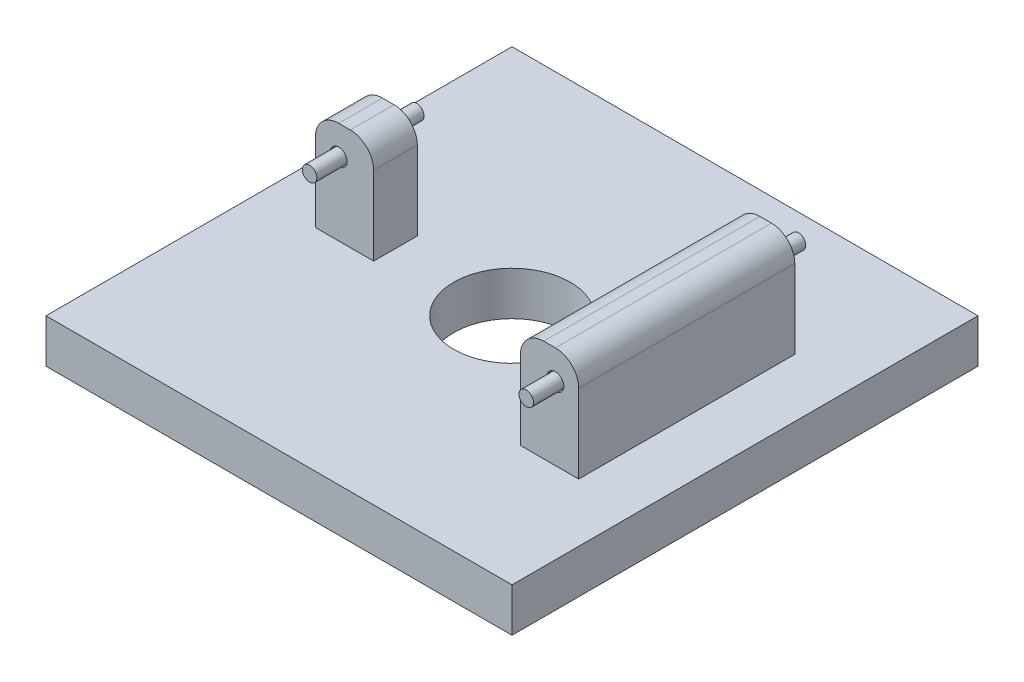
ISO-10303-21;
HEADER;
FILE_DESCRIPTION(('STEP AP214'),'2;1');
FILE_NAME('part.step','',(''),(''),'','','');
FILE_SCHEMA(('AUTOMOTIVE_DESIGN { 1 0 10303 214 1 1 1 1 }'));
ENDSEC;
DATA;
#1=APPLICATION_CONTEXT('core data for automotive mechanical design processes');
#2=APPLICATION_PROTOCOL_DEFINITION('international standard','automotive_design',2000,#1);
#3=PRODUCT_CONTEXT('',#1,'mechanical');
#4=PRODUCT('Part','Part','',(#3));
#5=PRODUCT_RELATED_PRODUCT_CATEGORY('part','',(#4));
#6=PRODUCT_DEFINITION_FORMATION('','',#4);
#7=PRODUCT_DEFINITION_CONTEXT('part definition',#1,'design');
#8=PRODUCT_DEFINITION('design','',#6,#7);
#9=PRODUCT_DEFINITION_SHAPE('','',#8);
#10=(LENGTH_UNIT() NAMED_UNIT(*) SI_UNIT(.MILLI.,.METRE.));
#11=(NAMED_UNIT(*) PLANE_ANGLE_UNIT() SI_UNIT($,.RADIAN.));
#12=(NAMED_UNIT(*) SI_UNIT($,.STERADIAN.) SOLID_ANGLE_UNIT());
#13=UNCERTAINTY_MEASURE_WITH_UNIT(LENGTH_MEASURE(1.E-05),#10,'distance_accuracy_value','');
#14=(GEOMETRIC_REPRESENTATION_CONTEXT(3) GLOBAL_UNCERTAINTY_ASSIGNED_CONTEXT((#13)) GLOBAL_UNIT_ASSIGNED_CONTEXT((#10,
#11,#12)) REPRESENTATION_CONTEXT('',''));
#15=CARTESIAN_POINT('',(0.,0.,0.));
#16=DIRECTION('',(0.,0.,1.));
#17=DIRECTION('',(1.,0.,0.));
#18=AXIS2_PLACEMENT_3D('',#15,#16,#17);
#19=CARTESIAN_POINT('',(16.51,12.7,-14.7209108940373));
#20=DIRECTION('',(0.,0.,1.));
#21=DIRECTION('',(1.,0.,0.));
#22=AXIS2_PLACEMENT_3D('',#19,#20,#21);
#23=CYLINDRICAL_SURFACE('',#22,0.793749999999999);
#24=CARTESIAN_POINT('',(16.51,12.7,-14.7209108940373));
#25=DIRECTION('',(0.,0.,1.));
#26=DIRECTION('',(1.,0.,0.));
#27=AXIS2_PLACEMENT_3D('',#24,#25,#26);
#28=CIRCLE('',#27,0.793749999999999);
#29=CARTESIAN_POINT('',(17.30375,12.7,-14.7209108940373));
#30=VERTEX_POINT('',#29);
#31=EDGE_CURVE('E12',#30,#30,#28,.T.);
#32=CARTESIAN_POINT('',(16.51,12.7,14.95425));
#33=DIRECTION('',(0.,0.,1.));
#34=DIRECTION('',(1.,0.,0.));
#35=AXIS2_PLACEMENT_3D('',#32,#33,#34);
#36=CIRCLE('',#35,0.793749999999999);
#37=CARTESIAN_POINT('',(17.30375,12.7,14.95425));
#38=VERTEX_POINT('',#37);
#39=EDGE_CURVE('E47',#38,#38,#36,.T.);
#40=CARTESIAN_POINT('',(17.30375,12.7,-14.7209108940373));
#41=CARTESIAN_POINT('',(17.30375,12.7,-14.4117946347244));
#42=CARTESIAN_POINT('',(17.30375,12.7,-14.1026783754115));
#43=CARTESIAN_POINT('',(17.30375,12.7,-13.4844458567858));
#44=CARTESIAN_POINT('',(17.30375,12.7,-13.1753295974729));
#45=CARTESIAN_POINT('',(17.30375,12.7,-12.5570970788471));
#46=CARTESIAN_POINT('',(17.30375,12.7,-12.2479808195342));
#47=CARTESIAN_POINT('',(17.30375,12.7,-11.6297483009084));
#48=CARTESIAN_POINT('',(17.30375,12.7,-11.3206320415955));
#49=CARTESIAN_POINT('',(17.30375,12.7,-10.7023995229698));
#50=CARTESIAN_POINT('',(17.30375,12.7,-10.3932832636569));
#51=CARTESIAN_POINT('',(17.30375,12.7,-9.77505074503109));
#52=CARTESIAN_POINT('',(17.30375,12.7,-9.46593448571821));
#53=CARTESIAN_POINT('',(17.30375,12.7,-8.84770196709243));
#54=CARTESIAN_POINT('',(17.30375,12.7,-8.53858570777954));
#55=CARTESIAN_POINT('',(17.30375,12.7,-7.92035318915376));
#56=CARTESIAN_POINT('',(17.30375,12.7,-7.61123692984087));
#57=CARTESIAN_POINT('',(17.30375,12.7,-6.9930044112151));
#58=CARTESIAN_POINT('',(17.30375,12.7,-6.68388815190221));
#59=CARTESIAN_POINT('',(17.30375,12.7,-6.06565563327643));
#60=CARTESIAN_POINT('',(17.30375,12.7,-5.75653937396354));
#61=CARTESIAN_POINT('',(17.30375,12.7,-5.13830685533776));
#62=CARTESIAN_POINT('',(17.30375,12.7,-4.82919059602488));
#63=CARTESIAN_POINT('',(17.30375,12.7,-4.2109580773991));
#64=CARTESIAN_POINT('',(17.30375,12.7,-3.90184181808621));
#65=CARTESIAN_POINT('',(17.30375,12.7,-3.28360929946043));
#66=CARTESIAN_POINT('',(17.30375,12.7,-2.97449304014755));
#67=CARTESIAN_POINT('',(17.30375,12.7,-2.35626052152177));
#68=CARTESIAN_POINT('',(17.30375,12.7,-2.04714426220888));
#69=CARTESIAN_POINT('',(17.30375,12.7,-1.4289117435831));
#70=CARTESIAN_POINT('',(17.30375,12.7,-1.11979548427021));
#71=CARTESIAN_POINT('',(17.30375,12.7,-0.501562965644435));
#72=CARTESIAN_POINT('',(17.30375,12.7,-0.192446706331546));
#73=CARTESIAN_POINT('',(17.30375,12.7,0.425785812294232));
#74=CARTESIAN_POINT('',(17.30375,12.7,0.73490207160712));
#75=CARTESIAN_POINT('',(17.30375,12.7,1.3531345902329));
#76=CARTESIAN_POINT('',(17.30375,12.7,1.66225084954579));
#77=CARTESIAN_POINT('',(17.30375,12.7,2.28048336817156));
#78=CARTESIAN_POINT('',(17.30375,12.7,2.58959962748445));
#79=CARTESIAN_POINT('',(17.30375,12.7,3.20783214611023));
#80=CARTESIAN_POINT('',(17.30375,12.7,3.51694840542312));
#81=CARTESIAN_POINT('',(17.30375,12.7,4.1351809240489));
#82=CARTESIAN_POINT('',(17.30375,12.7,4.44429718336179));
#83=CARTESIAN_POINT('',(17.30375,12.7,5.06252970198756));
#84=CARTESIAN_POINT('',(17.30375,12.7,5.37164596130045));
#85=CARTESIAN_POINT('',(17.30375,12.7,5.98987847992623));
#86=CARTESIAN_POINT('',(17.30375,12.7,6.29899473923912));
#87=CARTESIAN_POINT('',(17.30375,12.7,6.9172272578649));
#88=CARTESIAN_POINT('',(17.30375,12.7,7.22634351717778));
#89=CARTESIAN_POINT('',(17.30375,12.7,7.84457603580356));
#90=CARTESIAN_POINT('',(17.30375,12.7,8.15369229511645));
#91=CARTESIAN_POINT('',(17.30375,12.7,8.77192481374223));
#92=CARTESIAN_POINT('',(17.30375,12.7,9.08104107305511));
#93=CARTESIAN_POINT('',(17.30375,12.7,9.69927359168089));
#94=CARTESIAN_POINT('',(17.30375,12.7,10.0083898509938));
#95=CARTESIAN_POINT('',(17.30375,12.7,10.6266223696196));
#96=CARTESIAN_POINT('',(17.30375,12.7,10.9357386289324));
#97=CARTESIAN_POINT('',(17.30375,12.7,11.5539711475582));
#98=CARTESIAN_POINT('',(17.30375,12.7,11.8630874068711));
#99=CARTESIAN_POINT('',(17.30375,12.7,12.4813199254969));
#100=CARTESIAN_POINT('',(17.30375,12.7,12.7904361848098));
#101=CARTESIAN_POINT('',(17.30375,12.7,13.4086687034356));
#102=CARTESIAN_POINT('',(17.30375,12.7,13.7177849627484));
#103=CARTESIAN_POINT('',(17.30375,12.7,14.3360174813742));
#104=CARTESIAN_POINT('',(17.30375,12.7,14.6451337406871));
#105=CARTESIAN_POINT('',(17.30375,12.7,14.95425));
#106=B_SPLINE_CURVE_WITH_KNOTS('',3,(#40,#41,#42,#43,#44,#45,#46,#47,#48,#49,#50,#51,#52,#53,
#54,#55,#56,#57,#58,#59,#60,#61,#62,#63,#64,#65,#66,#67,#68,#69,#70,#71,#72,#73,#74,#75,#76,#77,
#78,#79,#80,#81,#82,#83,#84,#85,#86,#87,#88,#89,#90,#91,#92,#93,#94,#95,#96,#97,#98,#99,#100,
#101,#102,#103,#104,#105),.UNSPECIFIED.,.F.,.F.,(4,2,2,2,2,2,2,2,2,2,2,2,2,2,2,2,2,2,2,2,2,2,2,
2,2,2,2,2,2,2,2,2,4),(0.,0.927348777938666,1.85469755587733,2.782046333816,3.70939511175467,
4.63674388969333,5.564092667632,6.49144144557066,7.41879022350933,8.34613900144799,
9.27348777938666,10.2008365573253,11.128185335264,12.0555341132027,12.9828828911413,
13.91023166908,14.8375804470187,15.7649292249573,16.692278002896,17.6196267808347,
18.5469755587733,19.474324336712,20.4016731146507,21.3290218925893,22.256370670528,
23.1837194484666,24.1110682264053,25.038417004344,25.9657657822826,26.8931145602213,
27.82046333816,28.7478121160986,29.6751608940373),.UNSPECIFIED.);
#107=EDGE_CURVE('BSEAM41',#30,#38,#106,.T.);
#108=ORIENTED_EDGE('',*,*,#31,.T.);
#109=ORIENTED_EDGE('',*,*,#39,.F.);
#110=ORIENTED_EDGE('',*,*,#107,.T.);
#111=ORIENTED_EDGE('',*,*,#107,.F.);
#112=EDGE_LOOP('',(#108,#110,#109,#111));
#113=FACE_BOUND('',#112,.T.);
#114=ADVANCED_FACE('F41',(#113),#23,.T.);
#115=CARTESIAN_POINT('',(16.51,12.7,-14.7209108940373));
#116=DIRECTION('',(0.,0.,1.));
#117=DIRECTION('',(1.,0.,0.));
#118=AXIS2_PLACEMENT_3D('',#115,#116,#117);
#119=PLANE('',#118);
#120=ORIENTED_EDGE('',*,*,#31,.F.);
#121=EDGE_LOOP('',(#120));
#122=FACE_BOUND('',#121,.T.);
#123=ADVANCED_FACE('F56',(#122),#119,.F.);
#124=CARTESIAN_POINT('',(16.51,12.7,14.95425));
#125=DIRECTION('',(0.,0.,1.));
#126=DIRECTION('',(1.,0.,0.));
#127=AXIS2_PLACEMENT_3D('',#124,#125,#126);
#128=PLANE('',#127);
#129=ORIENTED_EDGE('',*,*,#39,.T.);
#130=EDGE_LOOP('',(#129));
#131=FACE_BOUND('',#130,.T.);
#132=ADVANCED_FACE('F53',(#131),#128,.T.);
#133=CLOSED_SHELL('',(#114,#123,#132));
#134=MANIFOLD_SOLID_BREP('B2',#133);
#135=CARTESIAN_POINT('',(-16.51,12.7,-6.12774999999997));
#136=DIRECTION('',(0.,0.,1.));
#137=DIRECTION('',(1.,0.,0.));
#138=AXIS2_PLACEMENT_3D('',#135,#136,#137);
#139=CYLINDRICAL_SURFACE('',#138,0.793749999999999);
#140=CARTESIAN_POINT('',(-16.51,12.7,-6.12774999999997));
#141=DIRECTION('',(0.,0.,1.));
#142=DIRECTION('',(1.,0.,0.));
#143=AXIS2_PLACEMENT_3D('',#140,#141,#142);
#144=CIRCLE('',#143,0.793749999999999);
#145=CARTESIAN_POINT('',(-15.71625,12.7,-6.12774999999997));
#146=VERTEX_POINT('',#145);
#147=EDGE_CURVE('E40',#146,#146,#144,.T.);
#148=ORIENTED_EDGE('',*,*,#147,.T.);
#149=EDGE_LOOP('',(#148));
#150=FACE_BOUND('',#149,.T.);
#151=CARTESIAN_POINT('',(-16.51,12.7,5.55624999999999));
#152=DIRECTION('',(0.,0.,1.));
#153=DIRECTION('',(1.,0.,0.));
#154=AXIS2_PLACEMENT_3D('',#151,#152,#153);
#155=CIRCLE('',#154,0.793749999999999);
#156=CARTESIAN_POINT('',(-15.71625,12.7,5.55624999999999));
#157=VERTEX_POINT('',#156);
#158=EDGE_CURVE('E96',#157,#157,#155,.T.);
#159=ORIENTED_EDGE('',*,*,#158,.F.);
#160=EDGE_LOOP('',(#159));
#161=FACE_BOUND('',#160,.T.);
#162=ADVANCED_FACE('F90',(#150,#161),#139,.T.);
#163=CARTESIAN_POINT('',(-16.51,12.7,-6.12774999999997));
#164=DIRECTION('',(0.,0.,1.));
#165=DIRECTION('',(1.,0.,0.));
#166=AXIS2_PLACEMENT_3D('',#163,#164,#165);
#167=PLANE('',#166);
#168=ORIENTED_EDGE('',*,*,#147,.F.);
#169=EDGE_LOOP('',(#168));
#170=FACE_BOUND('',#169,.T.);
#171=ADVANCED_FACE('F105',(#170),#167,.F.);
#172=CARTESIAN_POINT('',(-16.51,12.7,5.55624999999999));
#173=DIRECTION('',(0.,0.,1.));
#174=DIRECTION('',(1.,0.,0.));
#175=AXIS2_PLACEMENT_3D('',#172,#173,#174);
#176=PLANE('',#175);
#177=ORIENTED_EDGE('',*,*,#158,.T.);
#178=EDGE_LOOP('',(#177));
#179=FACE_BOUND('',#178,.T.);
#180=ADVANCED_FACE('F102',(#179),#176,.T.);
#181=CLOSED_SHELL('',(#162,#171,#180));
#182=MANIFOLD_SOLID_BREP('B7',#181);
#183=CARTESIAN_POINT('',(0.,4.7625,0.));
#184=DIRECTION('',(0.,1.,0.));
#185=DIRECTION('',(0.,0.,1.));
#186=AXIS2_PLACEMENT_3D('',#183,#184,#185);
#187=PLANE('',#186);
#188=CARTESIAN_POINT('',(0.,4.7625,0.));
#189=DIRECTION('',(0.,1.,0.));
#190=DIRECTION('',(0.,0.,1.));
#191=AXIS2_PLACEMENT_3D('',#188,#189,#190);
#192=CIRCLE('',#191,6.35);
#193=CARTESIAN_POINT('',(0.,4.7625,6.35));
#194=VERTEX_POINT('',#193);
#195=EDGE_CURVE('E307',#194,#194,#192,.T.);
#196=ORIENTED_EDGE('',*,*,#195,.F.);
#197=EDGE_LOOP('',(#196));
#198=FACE_BOUND('',#197,.T.);
#199=DIRECTION('',(0.,0.,-1.));
#200=VECTOR('',#199,1.);
#201=CARTESIAN_POINT('',(25.4,4.7625,-25.4));
#202=LINE('',#201,#200);
#203=CARTESIAN_POINT('',(25.4,4.7625,25.4));
#204=VERTEX_POINT('',#203);
#205=CARTESIAN_POINT('',(25.4,4.7625,-25.4));
#206=VERTEX_POINT('',#205);
#207=EDGE_CURVE('E314',#204,#206,#202,.T.);
#208=ORIENTED_EDGE('',*,*,#207,.T.);
#209=DIRECTION('',(-1.,0.,0.));
#210=VECTOR('',#209,1.);
#211=CARTESIAN_POINT('',(-25.4,4.7625,-25.4));
#212=LINE('',#211,#210);
#213=CARTESIAN_POINT('',(-25.4,4.7625,-25.4));
#214=VERTEX_POINT('',#213);
#215=EDGE_CURVE('E317',#206,#214,#212,.T.);
#216=ORIENTED_EDGE('',*,*,#215,.T.);
#217=DIRECTION('',(0.,0.,1.));
#218=VECTOR('',#217,1.);
#219=CARTESIAN_POINT('',(-25.4,4.7625,-25.4));
#220=LINE('',#219,#218);
#221=CARTESIAN_POINT('',(-25.4,4.7625,25.4));
#222=VERTEX_POINT('',#221);
#223=EDGE_CURVE('E320',#214,#222,#220,.T.);
#224=ORIENTED_EDGE('',*,*,#223,.T.);
#225=DIRECTION('',(1.,0.,0.));
#226=VECTOR('',#225,1.);
#227=CARTESIAN_POINT('',(-25.4,4.7625,25.4));
#228=LINE('',#227,#226);
#229=EDGE_CURVE('E322',#222,#204,#228,.T.);
#230=ORIENTED_EDGE('',*,*,#229,.T.);
#231=EDGE_LOOP('',(#208,#216,#224,#230));
#232=FACE_BOUND('',#231,.T.);
#233=DIRECTION('',(1.,0.,0.));
#234=VECTOR('',#233,1.);
#235=CARTESIAN_POINT('',(-19.05,4.7625,2.38124999999999));
#236=LINE('',#235,#234);
#237=CARTESIAN_POINT('',(-19.05,4.7625,2.38124999999999));
#238=VERTEX_POINT('',#237);
#239=CARTESIAN_POINT('',(-12.7,4.7625,2.38124999999999));
#240=VERTEX_POINT('',#239);
#241=EDGE_CURVE('E292',#238,#240,#236,.T.);
#242=ORIENTED_EDGE('',*,*,#241,.F.);
#243=DIRECTION('',(0.,0.,1.));
#244=VECTOR('',#243,1.);
#245=CARTESIAN_POINT('',(-19.05,4.7625,-2.38125000000001));
#246=LINE('',#245,#244);
#247=CARTESIAN_POINT('',(-19.05,4.7625,-2.38125000000001));
#248=VERTEX_POINT('',#247);
#249=EDGE_CURVE('E255',#248,#238,#246,.T.);
#250=ORIENTED_EDGE('',*,*,#249,.F.);
#251=DIRECTION('',(-1.,0.,0.));
#252=VECTOR('',#251,1.);
#253=CARTESIAN_POINT('',(-19.05,4.7625,-2.38125000000001));
#254=LINE('',#253,#252);
#255=CARTESIAN_POINT('',(-12.7,4.7625,-2.38125));
#256=VERTEX_POINT('',#255);
#257=EDGE_CURVE('E286',#256,#248,#254,.T.);
#258=ORIENTED_EDGE('',*,*,#257,.F.);
#259=DIRECTION('',(0.,0.,-1.));
#260=VECTOR('',#259,1.);
#261=CARTESIAN_POINT('',(-12.7,4.7625,-2.38125));
#262=LINE('',#261,#260);
#263=EDGE_CURVE('E295',#240,#256,#262,.T.);
#264=ORIENTED_EDGE('',*,*,#263,.F.);
#265=EDGE_LOOP('',(#242,#250,#258,#264));
#266=FACE_BOUND('',#265,.T.);
#267=DIRECTION('',(-1.,0.,0.));
#268=VECTOR('',#267,1.);
#269=CARTESIAN_POINT('',(19.05,4.7625,-11.77925));
#270=LINE('',#269,#268);
#271=CARTESIAN_POINT('',(19.05,4.7625,-11.77925));
#272=VERTEX_POINT('',#271);
#273=CARTESIAN_POINT('',(12.7,4.7625,-11.77925));
#274=VERTEX_POINT('',#273);
#275=EDGE_CURVE('E250',#272,#274,#270,.T.);
#276=ORIENTED_EDGE('',*,*,#275,.F.);
#277=DIRECTION('',(0.,0.,-1.));
#278=VECTOR('',#277,1.);
#279=CARTESIAN_POINT('',(19.05,4.7625,-11.77925));
#280=LINE('',#279,#278);
#281=CARTESIAN_POINT('',(19.05,4.7625,11.77925));
#282=VERTEX_POINT('',#281);
#283=EDGE_CURVE('E259',#282,#272,#280,.T.);
#284=ORIENTED_EDGE('',*,*,#283,.F.);
#285=DIRECTION('',(1.,0.,0.));
#286=VECTOR('',#285,1.);
#287=CARTESIAN_POINT('',(19.05,4.7625,11.77925));
#288=LINE('',#287,#286);
#289=CARTESIAN_POINT('',(12.7,4.7625,11.77925));
#290=VERTEX_POINT('',#289);
#291=EDGE_CURVE('E271',#290,#282,#288,.T.);
#292=ORIENTED_EDGE('',*,*,#291,.F.);
#293=DIRECTION('',(0.,0.,1.));
#294=VECTOR('',#293,1.);
#295=CARTESIAN_POINT('',(12.7,4.7625,-11.77925));
#296=LINE('',#295,#294);
#297=EDGE_CURVE('E269',#274,#290,#296,.T.);
#298=ORIENTED_EDGE('',*,*,#297,.F.);
#299=EDGE_LOOP('',(#276,#284,#292,#298));
#300=FACE_BOUND('',#299,.T.);
#301=ADVANCED_FACE('F131',(#198,#232,#266,#300),#187,.T.);
#302=CARTESIAN_POINT('',(25.4,4.7625,-25.4));
#303=DIRECTION('',(-1.,0.,0.));
#304=DIRECTION('',(0.,0.,1.));
#305=AXIS2_PLACEMENT_3D('',#302,#303,#304);
#306=PLANE('',#305);
#307=DIRECTION('',(0.,0.,-1.));
#308=VECTOR('',#307,1.);
#309=CARTESIAN_POINT('',(25.4,0.,-25.4));
#310=LINE('',#309,#308);
#311=CARTESIAN_POINT('',(25.4,0.,25.4));
#312=VERTEX_POINT('',#311);
#313=CARTESIAN_POINT('',(25.4,0.,-25.4));
#314=VERTEX_POINT('',#313);
#315=EDGE_CURVE('E311',#312,#314,#310,.T.);
#316=ORIENTED_EDGE('',*,*,#315,.T.);
#317=DIRECTION('',(0.,-1.,0.));
#318=VECTOR('',#317,1.);
#319=CARTESIAN_POINT('',(25.4,4.7625,-25.4));
#320=LINE('',#319,#318);
#321=EDGE_CURVE('E340',#206,#314,#320,.T.);
#322=ORIENTED_EDGE('',*,*,#321,.F.);
#323=ORIENTED_EDGE('',*,*,#207,.F.);
#324=DIRECTION('',(0.,-1.,0.));
#325=VECTOR('',#324,1.);
#326=CARTESIAN_POINT('',(25.4,4.7625,25.4));
#327=LINE('',#326,#325);
#328=EDGE_CURVE('E324',#204,#312,#327,.T.);
#329=ORIENTED_EDGE('',*,*,#328,.T.);
#330=EDGE_LOOP('',(#316,#322,#323,#329));
#331=FACE_BOUND('',#330,.T.);
#332=ADVANCED_FACE('F409',(#331),#306,.F.);
#333=CARTESIAN_POINT('',(-25.4,4.7625,-25.4));
#334=DIRECTION('',(0.,0.,1.));
#335=DIRECTION('',(1.,0.,0.));
#336=AXIS2_PLACEMENT_3D('',#333,#334,#335);
#337=PLANE('',#336);
#338=DIRECTION('',(-1.,0.,0.));
#339=VECTOR('',#338,1.);
#340=CARTESIAN_POINT('',(-25.4,0.,-25.4));
#341=LINE('',#340,#339);
#342=CARTESIAN_POINT('',(-25.4,0.,-25.4));
#343=VERTEX_POINT('',#342);
#344=EDGE_CURVE('E327',#314,#343,#341,.T.);
#345=ORIENTED_EDGE('',*,*,#344,.T.);
#346=DIRECTION('',(0.,-1.,0.));
#347=VECTOR('',#346,1.);
#348=CARTESIAN_POINT('',(-25.4,4.7625,-25.4));
#349=LINE('',#348,#347);
#350=EDGE_CURVE('E337',#214,#343,#349,.T.);
#351=ORIENTED_EDGE('',*,*,#350,.F.);
#352=ORIENTED_EDGE('',*,*,#215,.F.);
#353=ORIENTED_EDGE('',*,*,#321,.T.);
#354=EDGE_LOOP('',(#345,#351,#352,#353));
#355=FACE_BOUND('',#354,.T.);
#356=ADVANCED_FACE('F415',(#355),#337,.F.);
#357=CARTESIAN_POINT('',(-25.4,4.7625,-25.4));
#358=DIRECTION('',(1.,0.,0.));
#359=DIRECTION('',(0.,0.,-1.));
#360=AXIS2_PLACEMENT_3D('',#357,#358,#359);
#361=PLANE('',#360);
#362=DIRECTION('',(0.,0.,1.));
#363=VECTOR('',#362,1.);
#364=CARTESIAN_POINT('',(-25.4,0.,-25.4));
#365=LINE('',#364,#363);
#366=CARTESIAN_POINT('',(-25.4,0.,25.4));
#367=VERTEX_POINT('',#366);
#368=EDGE_CURVE('E329',#343,#367,#365,.T.);
#369=ORIENTED_EDGE('',*,*,#368,.T.);
#370=DIRECTION('',(0.,-1.,0.));
#371=VECTOR('',#370,1.);
#372=CARTESIAN_POINT('',(-25.4,4.7625,25.4));
#373=LINE('',#372,#371);
#374=EDGE_CURVE('E334',#222,#367,#373,.T.);
#375=ORIENTED_EDGE('',*,*,#374,.F.);
#376=ORIENTED_EDGE('',*,*,#223,.F.);
#377=ORIENTED_EDGE('',*,*,#350,.T.);
#378=EDGE_LOOP('',(#369,#375,#376,#377));
#379=FACE_BOUND('',#378,.T.);
#380=ADVANCED_FACE('F431',(#379),#361,.F.);
#381=CARTESIAN_POINT('',(-25.4,4.7625,25.4));
#382=DIRECTION('',(0.,0.,-1.));
#383=DIRECTION('',(-1.,0.,0.));
#384=AXIS2_PLACEMENT_3D('',#381,#382,#383);
#385=PLANE('',#384);
#386=DIRECTION('',(1.,0.,0.));
#387=VECTOR('',#386,1.);
#388=CARTESIAN_POINT('',(-25.4,0.,25.4));
#389=LINE('',#388,#387);
#390=EDGE_CURVE('E318',#367,#312,#389,.T.);
#391=ORIENTED_EDGE('',*,*,#390,.T.);
#392=ORIENTED_EDGE('',*,*,#328,.F.);
#393=ORIENTED_EDGE('',*,*,#229,.F.);
#394=ORIENTED_EDGE('',*,*,#374,.T.);
#395=EDGE_LOOP('',(#391,#392,#393,#394));
#396=FACE_BOUND('',#395,.T.);
#397=ADVANCED_FACE('F427',(#396),#385,.F.);
#398=CARTESIAN_POINT('',(0.,0.,0.));
#399=DIRECTION('',(0.,1.,0.));
#400=DIRECTION('',(0.,0.,1.));
#401=AXIS2_PLACEMENT_3D('',#398,#399,#400);
#402=PLANE('',#401);
#403=CARTESIAN_POINT('',(0.,0.,0.));
#404=DIRECTION('',(0.,1.,0.));
#405=DIRECTION('',(0.,0.,1.));
#406=AXIS2_PLACEMENT_3D('',#403,#404,#405);
#407=CIRCLE('',#406,6.35);
#408=CARTESIAN_POINT('',(0.,0.,6.35));
#409=VERTEX_POINT('',#408);
#410=EDGE_CURVE('E308',#409,#409,#407,.T.);
#411=ORIENTED_EDGE('',*,*,#410,.T.);
#412=EDGE_LOOP('',(#411));
#413=FACE_BOUND('',#412,.T.);
#414=ORIENTED_EDGE('',*,*,#315,.F.);
#415=ORIENTED_EDGE('',*,*,#390,.F.);
#416=ORIENTED_EDGE('',*,*,#368,.F.);
#417=ORIENTED_EDGE('',*,*,#344,.F.);
#418=EDGE_LOOP('',(#414,#415,#416,#417));
#419=FACE_BOUND('',#418,.T.);
#420=ADVANCED_FACE('F424',(#413,#419),#402,.F.);
#421=CARTESIAN_POINT('',(0.,0.,0.));
#422=DIRECTION('',(0.,1.,0.));
#423=DIRECTION('',(0.,0.,1.));
#424=AXIS2_PLACEMENT_3D('',#421,#422,#423);
#425=CYLINDRICAL_SURFACE('',#424,6.35);
#426=CARTESIAN_POINT('',(0.,0.,6.35));
#427=CARTESIAN_POINT('',(0.,0.049609375,6.35));
#428=CARTESIAN_POINT('',(0.,0.09921875,6.35));
#429=CARTESIAN_POINT('',(0.,0.1984375,6.35));
#430=CARTESIAN_POINT('',(0.,0.248046875,6.35));
#431=CARTESIAN_POINT('',(0.,0.347265625,6.35));
#432=CARTESIAN_POINT('',(0.,0.396875,6.35));
#433=CARTESIAN_POINT('',(0.,0.49609375,6.35));
#434=CARTESIAN_POINT('',(0.,0.545703125,6.35));
#435=CARTESIAN_POINT('',(0.,0.644921875,6.35));
#436=CARTESIAN_POINT('',(0.,0.69453125,6.35));
#437=CARTESIAN_POINT('',(0.,0.79375,6.35));
#438=CARTESIAN_POINT('',(0.,0.843359375,6.35));
#439=CARTESIAN_POINT('',(0.,0.942578125,6.35));
#440=CARTESIAN_POINT('',(0.,0.9921875,6.35));
#441=CARTESIAN_POINT('',(0.,1.09140625,6.35));
#442=CARTESIAN_POINT('',(0.,1.141015625,6.35));
#443=CARTESIAN_POINT('',(0.,1.240234375,6.35));
#444=CARTESIAN_POINT('',(0.,1.28984375,6.35));
#445=CARTESIAN_POINT('',(0.,1.3890625,6.35));
#446=CARTESIAN_POINT('',(0.,1.438671875,6.35));
#447=CARTESIAN_POINT('',(0.,1.537890625,6.35));
#448=CARTESIAN_POINT('',(0.,1.5875,6.35));
#449=CARTESIAN_POINT('',(0.,1.68671875,6.35));
#450=CARTESIAN_POINT('',(0.,1.736328125,6.35));
#451=CARTESIAN_POINT('',(0.,1.835546875,6.35));
#452=CARTESIAN_POINT('',(0.,1.88515625,6.35));
#453=CARTESIAN_POINT('',(0.,1.984375,6.35));
#454=CARTESIAN_POINT('',(0.,2.033984375,6.35));
#455=CARTESIAN_POINT('',(0.,2.133203125,6.35));
#456=CARTESIAN_POINT('',(0.,2.1828125,6.35));
#457=CARTESIAN_POINT('',(0.,2.28203125,6.35));
#458=CARTESIAN_POINT('',(0.,2.331640625,6.35));
#459=CARTESIAN_POINT('',(0.,2.430859375,6.35));
#460=CARTESIAN_POINT('',(0.,2.48046875,6.35));
#461=CARTESIAN_POINT('',(0.,2.5796875,6.35));
#462=CARTESIAN_POINT('',(0.,2.629296875,6.35));
#463=CARTESIAN_POINT('',(0.,2.728515625,6.35));
#464=CARTESIAN_POINT('',(0.,2.778125,6.35));
#465=CARTESIAN_POINT('',(0.,2.87734375,6.35));
#466=CARTESIAN_POINT('',(0.,2.926953125,6.35));
#467=CARTESIAN_POINT('',(0.,3.026171875,6.35));
#468=CARTESIAN_POINT('',(0.,3.07578125,6.35));
#469=CARTESIAN_POINT('',(0.,3.175,6.35));
#470=CARTESIAN_POINT('',(0.,3.224609375,6.35));
#471=CARTESIAN_POINT('',(0.,3.323828125,6.35));
#472=CARTESIAN_POINT('',(0.,3.3734375,6.35));
#473=CARTESIAN_POINT('',(0.,3.47265625,6.35));
#474=CARTESIAN_POINT('',(0.,3.522265625,6.35));
#475=CARTESIAN_POINT('',(0.,3.621484375,6.35));
#476=CARTESIAN_POINT('',(0.,3.67109375,6.35));
#477=CARTESIAN_POINT('',(0.,3.7703125,6.35));
#478=CARTESIAN_POINT('',(0.,3.819921875,6.35));
#479=CARTESIAN_POINT('',(0.,3.919140625,6.35));
#480=CARTESIAN_POINT('',(0.,3.96875,6.35));
#481=CARTESIAN_POINT('',(0.,4.06796875,6.35));
#482=CARTESIAN_POINT('',(0.,4.117578125,6.35));
#483=CARTESIAN_POINT('',(0.,4.216796875,6.35));
#484=CARTESIAN_POINT('',(0.,4.26640625,6.35));
#485=CARTESIAN_POINT('',(0.,4.365625,6.35));
#486=CARTESIAN_POINT('',(0.,4.415234375,6.35));
#487=CARTESIAN_POINT('',(0.,4.514453125,6.35));
#488=CARTESIAN_POINT('',(0.,4.5640625,6.35));
#489=CARTESIAN_POINT('',(0.,4.66328125,6.35));
#490=CARTESIAN_POINT('',(0.,4.712890625,6.35));
#491=CARTESIAN_POINT('',(0.,4.7625,6.35));
#492=B_SPLINE_CURVE_WITH_KNOTS('',3,(#426,#427,#428,#429,#430,#431,#432,#433,#434,#435,#436,
#437,#438,#439,#440,#441,#442,#443,#444,#445,#446,#447,#448,#449,#450,#451,#452,#453,#454,#455,
#456,#457,#458,#459,#460,#461,#462,#463,#464,#465,#466,#467,#468,#469,#470,#471,#472,#473,#474,
#475,#476,#477,#478,#479,#480,#481,#482,#483,#484,#485,#486,#487,#488,#489,#490,#491),
.UNSPECIFIED.,.F.,.F.,(4,2,2,2,2,2,2,2,2,2,2,2,2,2,2,2,2,2,2,2,2,2,2,2,2,2,2,2,2,2,2,2,4),(0.,
0.148828125,0.29765625,0.446484375,0.5953125,0.744140625,0.89296875,1.041796875,1.190625,
1.339453125,1.48828125,1.637109375,1.7859375,1.934765625,2.08359375,2.232421875,2.38125,
2.530078125,2.67890625,2.827734375,2.9765625,3.125390625,3.27421875,3.423046875,3.571875,
3.720703125,3.86953125,4.018359375,4.1671875,4.316015625,4.46484375,4.613671875,4.7625),.UNSPECIFIED.);
#493=EDGE_CURVE('BSEAM422',#409,#194,#492,.T.);
#494=ORIENTED_EDGE('',*,*,#410,.F.);
#495=ORIENTED_EDGE('',*,*,#195,.T.);
#496=ORIENTED_EDGE('',*,*,#493,.T.);
#497=ORIENTED_EDGE('',*,*,#493,.F.);
#498=EDGE_LOOP('',(#494,#496,#495,#497));
#499=FACE_BOUND('',#498,.T.);
#500=ADVANCED_FACE('F422',(#499),#425,.F.);
#501=CARTESIAN_POINT('',(-19.05,15.875,-2.38125000000001));
#502=DIRECTION('',(1.,0.,0.));
#503=DIRECTION('',(0.,0.,-1.));
#504=AXIS2_PLACEMENT_3D('',#501,#502,#503);
#505=PLANE('',#504);
#506=DIRECTION('',(0.,-1.,0.));
#507=VECTOR('',#506,1.);
#508=CARTESIAN_POINT('',(-19.05,15.875,2.38124999999999));
#509=LINE('',#508,#507);
#510=CARTESIAN_POINT('',(-19.05,13.335,2.38124999999999));
#511=VERTEX_POINT('',#510);
#512=EDGE_CURVE('E305',#511,#238,#509,.T.);
#513=ORIENTED_EDGE('',*,*,#512,.F.);
#514=DIRECTION('',(0.,0.,1.));
#515=VECTOR('',#514,1.);
#516=CARTESIAN_POINT('',(-19.05,13.335,-2.38125000000001));
#517=LINE('',#516,#515);
#518=CARTESIAN_POINT('',(-19.05,13.335,-2.38125000000001));
#519=VERTEX_POINT('',#518);
#520=EDGE_CURVE('E154',#511,#519,#517,.F.);
#521=ORIENTED_EDGE('',*,*,#520,.T.);
#522=DIRECTION('',(0.,-1.,0.));
#523=VECTOR('',#522,1.);
#524=CARTESIAN_POINT('',(-19.05,15.875,-2.38125000000001));
#525=LINE('',#524,#523);
#526=EDGE_CURVE('E289',#519,#248,#525,.T.);
#527=ORIENTED_EDGE('',*,*,#526,.T.);
#528=ORIENTED_EDGE('',*,*,#249,.T.);
#529=EDGE_LOOP('',(#513,#521,#527,#528));
#530=FACE_BOUND('',#529,.T.);
#531=ADVANCED_FACE('F386',(#530),#505,.F.);
#532=CARTESIAN_POINT('',(-19.05,15.875,2.38124999999999));
#533=DIRECTION('',(0.,0.,-1.));
#534=DIRECTION('',(-1.,0.,0.));
#535=AXIS2_PLACEMENT_3D('',#532,#533,#534);
#536=PLANE('',#535);
#537=CARTESIAN_POINT('',(-16.51,12.7,2.38124999999999));
#538=DIRECTION('',(0.,0.,-1.));
#539=DIRECTION('',(-1.,0.,0.));
#540=AXIS2_PLACEMENT_3D('',#537,#538,#539);
#541=CIRCLE('',#540,0.92075);
#542=CARTESIAN_POINT('',(-17.43075,12.7,2.38124999999999));
#543=VERTEX_POINT('',#542);
#544=EDGE_CURVE('E266',#543,#543,#541,.T.);
#545=ORIENTED_EDGE('',*,*,#544,.T.);
#546=EDGE_LOOP('',(#545));
#547=FACE_BOUND('',#546,.T.);
#548=DIRECTION('',(1.,0.,0.));
#549=VECTOR('',#548,1.);
#550=CARTESIAN_POINT('',(-19.05,15.875,2.38124999999999));
#551=LINE('',#550,#549);
#552=CARTESIAN_POINT('',(-16.51,15.875,2.38124999999999));
#553=VERTEX_POINT('',#552);
#554=CARTESIAN_POINT('',(-15.24,15.875,2.38124999999999));
#555=VERTEX_POINT('',#554);
#556=EDGE_CURVE('E282',#553,#555,#551,.T.);
#557=ORIENTED_EDGE('',*,*,#556,.F.);
#558=CARTESIAN_POINT('',(-16.51,13.335,2.38124999999999));
#559=DIRECTION('',(0.,0.,-1.));
#560=DIRECTION('',(-1.,0.,0.));
#561=AXIS2_PLACEMENT_3D('',#558,#559,#560);
#562=CIRCLE('',#561,2.54);
#563=EDGE_CURVE('E372',#553,#511,#562,.F.);
#564=ORIENTED_EDGE('',*,*,#563,.T.);
#565=ORIENTED_EDGE('',*,*,#512,.T.);
#566=ORIENTED_EDGE('',*,*,#241,.T.);
#567=DIRECTION('',(0.,-1.,0.));
#568=VECTOR('',#567,1.);
#569=CARTESIAN_POINT('',(-12.7,15.875,2.38124999999999));
#570=LINE('',#569,#568);
#571=CARTESIAN_POINT('',(-12.7,13.335,2.38124999999999));
#572=VERTEX_POINT('',#571);
#573=EDGE_CURVE('E303',#572,#240,#570,.T.);
#574=ORIENTED_EDGE('',*,*,#573,.F.);
#575=CARTESIAN_POINT('',(-15.24,13.335,2.38124999999999));
#576=DIRECTION('',(0.,0.,-1.));
#577=DIRECTION('',(-1.,0.,0.));
#578=AXIS2_PLACEMENT_3D('',#575,#576,#577);
#579=CIRCLE('',#578,2.54);
#580=EDGE_CURVE('E370',#572,#555,#579,.F.);
#581=ORIENTED_EDGE('',*,*,#580,.T.);
#582=EDGE_LOOP('',(#557,#564,#565,#566,#574,#581));
#583=FACE_BOUND('',#582,.T.);
#584=ADVANCED_FACE('F385',(#547,#583),#536,.F.);
#585=CARTESIAN_POINT('',(-12.7,15.875,-2.38125));
#586=DIRECTION('',(-1.,0.,0.));
#587=DIRECTION('',(0.,0.,1.));
#588=AXIS2_PLACEMENT_3D('',#585,#586,#587);
#589=PLANE('',#588);
#590=DIRECTION('',(0.,-1.,0.));
#591=VECTOR('',#590,1.);
#592=CARTESIAN_POINT('',(-12.7,15.875,-2.38125));
#593=LINE('',#592,#591);
#594=CARTESIAN_POINT('',(-12.7,13.335,-2.38125));
#595=VERTEX_POINT('',#594);
#596=EDGE_CURVE('E301',#595,#256,#593,.T.);
#597=ORIENTED_EDGE('',*,*,#596,.F.);
#598=DIRECTION('',(0.,0.,-1.));
#599=VECTOR('',#598,1.);
#600=CARTESIAN_POINT('',(-12.7,13.335,2.38124999999999));
#601=LINE('',#600,#599);
#602=EDGE_CURVE('E88',#595,#572,#601,.F.);
#603=ORIENTED_EDGE('',*,*,#602,.T.);
#604=ORIENTED_EDGE('',*,*,#573,.T.);
#605=ORIENTED_EDGE('',*,*,#263,.T.);
#606=EDGE_LOOP('',(#597,#603,#604,#605));
#607=FACE_BOUND('',#606,.T.);
#608=ADVANCED_FACE('F397',(#607),#589,.F.);
#609=CARTESIAN_POINT('',(-19.05,15.875,-2.38125000000001));
#610=DIRECTION('',(0.,0.,1.));
#611=DIRECTION('',(1.,0.,0.));
#612=AXIS2_PLACEMENT_3D('',#609,#610,#611);
#613=PLANE('',#612);
#614=CARTESIAN_POINT('',(-16.51,12.7,-2.38125));
#615=DIRECTION('',(0.,0.,1.));
#616=DIRECTION('',(1.,0.,0.));
#617=AXIS2_PLACEMENT_3D('',#614,#615,#616);
#618=CIRCLE('',#617,0.92075);
#619=CARTESIAN_POINT('',(-15.58925,12.7,-2.38125));
#620=VERTEX_POINT('',#619);
#621=EDGE_CURVE('E344',#620,#620,#618,.T.);
#622=ORIENTED_EDGE('',*,*,#621,.T.);
#623=EDGE_LOOP('',(#622));
#624=FACE_BOUND('',#623,.T.);
#625=ORIENTED_EDGE('',*,*,#526,.F.);
#626=CARTESIAN_POINT('',(-16.51,13.335,-2.38125));
#627=DIRECTION('',(0.,0.,1.));
#628=DIRECTION('',(1.,0.,0.));
#629=AXIS2_PLACEMENT_3D('',#626,#627,#628);
#630=CIRCLE('',#629,2.54);
#631=CARTESIAN_POINT('',(-16.51,15.875,-2.38125));
#632=VERTEX_POINT('',#631);
#633=EDGE_CURVE('E139',#519,#632,#630,.F.);
#634=ORIENTED_EDGE('',*,*,#633,.T.);
#635=DIRECTION('',(-1.,0.,0.));
#636=VECTOR('',#635,1.);
#637=CARTESIAN_POINT('',(-19.05,15.875,-2.38125000000001));
#638=LINE('',#637,#636);
#639=CARTESIAN_POINT('',(-15.24,15.875,-2.38125));
#640=VERTEX_POINT('',#639);
#641=EDGE_CURVE('E285',#640,#632,#638,.T.);
#642=ORIENTED_EDGE('',*,*,#641,.F.);
#643=CARTESIAN_POINT('',(-15.24,13.335,-2.38125));
#644=DIRECTION('',(0.,0.,1.));
#645=DIRECTION('',(1.,0.,0.));
#646=AXIS2_PLACEMENT_3D('',#643,#644,#645);
#647=CIRCLE('',#646,2.54);
#648=EDGE_CURVE('E146',#640,#595,#647,.F.);
#649=ORIENTED_EDGE('',*,*,#648,.T.);
#650=ORIENTED_EDGE('',*,*,#596,.T.);
#651=ORIENTED_EDGE('',*,*,#257,.T.);
#652=EDGE_LOOP('',(#625,#634,#642,#649,#650,#651));
#653=FACE_BOUND('',#652,.T.);
#654=ADVANCED_FACE('F376',(#624,#653),#613,.F.);
#655=CARTESIAN_POINT('',(0.,15.875,0.));
#656=DIRECTION('',(0.,1.,0.));
#657=DIRECTION('',(0.,0.,1.));
#658=AXIS2_PLACEMENT_3D('',#655,#656,#657);
#659=PLANE('',#658);
#660=ORIENTED_EDGE('',*,*,#641,.T.);
#661=DIRECTION('',(0.,0.,1.));
#662=VECTOR('',#661,1.);
#663=CARTESIAN_POINT('',(-16.51,15.875,2.38124999999999));
#664=LINE('',#663,#662);
#665=EDGE_CURVE('E367',#632,#553,#664,.T.);
#666=ORIENTED_EDGE('',*,*,#665,.T.);
#667=ORIENTED_EDGE('',*,*,#556,.T.);
#668=DIRECTION('',(0.,0.,-1.));
#669=VECTOR('',#668,1.);
#670=CARTESIAN_POINT('',(-15.24,15.875,-2.38125));
#671=LINE('',#670,#669);
#672=EDGE_CURVE('E364',#555,#640,#671,.T.);
#673=ORIENTED_EDGE('',*,*,#672,.T.);
#674=EDGE_LOOP('',(#660,#666,#667,#673));
#675=FACE_BOUND('',#674,.T.);
#676=ADVANCED_FACE('F380',(#675),#659,.T.);
#677=CARTESIAN_POINT('',(19.05,15.875,-11.77925));
#678=DIRECTION('',(-1.,0.,0.));
#679=DIRECTION('',(0.,0.,1.));
#680=AXIS2_PLACEMENT_3D('',#677,#678,#679);
#681=PLANE('',#680);
#682=DIRECTION('',(0.,-1.,0.));
#683=VECTOR('',#682,1.);
#684=CARTESIAN_POINT('',(19.05,15.875,-11.77925));
#685=LINE('',#684,#683);
#686=CARTESIAN_POINT('',(19.05,13.335,-11.77925));
#687=VERTEX_POINT('',#686);
#688=EDGE_CURVE('E244',#687,#272,#685,.T.);
#689=ORIENTED_EDGE('',*,*,#688,.F.);
#690=DIRECTION('',(0.,0.,-1.));
#691=VECTOR('',#690,1.);
#692=CARTESIAN_POINT('',(19.05,13.335,-11.77925));
#693=LINE('',#692,#691);
#694=CARTESIAN_POINT('',(19.05,13.335,11.77925));
#695=VERTEX_POINT('',#694);
#696=EDGE_CURVE('E356',#687,#695,#693,.F.);
#697=ORIENTED_EDGE('',*,*,#696,.T.);
#698=DIRECTION('',(0.,-1.,0.));
#699=VECTOR('',#698,1.);
#700=CARTESIAN_POINT('',(19.05,15.875,11.77925));
#701=LINE('',#700,#699);
#702=EDGE_CURVE('E262',#695,#282,#701,.T.);
#703=ORIENTED_EDGE('',*,*,#702,.T.);
#704=ORIENTED_EDGE('',*,*,#283,.T.);
#705=EDGE_LOOP('',(#689,#697,#703,#704));
#706=FACE_BOUND('',#705,.T.);
#707=ADVANCED_FACE('F260',(#706),#681,.F.);
#708=CARTESIAN_POINT('',(19.05,15.875,-11.77925));
#709=DIRECTION('',(0.,0.,1.));
#710=DIRECTION('',(1.,0.,0.));
#711=AXIS2_PLACEMENT_3D('',#708,#709,#710);
#712=PLANE('',#711);
#713=CARTESIAN_POINT('',(16.51,12.7,-11.77925));
#714=DIRECTION('',(0.,0.,1.));
#715=DIRECTION('',(1.,0.,0.));
#716=AXIS2_PLACEMENT_3D('',#713,#714,#715);
#717=CIRCLE('',#716,0.92075);
#718=CARTESIAN_POINT('',(17.43075,12.7,-11.77925));
#719=VERTEX_POINT('',#718);
#720=EDGE_CURVE('E347',#719,#719,#717,.F.);
#721=ORIENTED_EDGE('',*,*,#720,.F.);
#722=EDGE_LOOP('',(#721));
#723=FACE_BOUND('',#722,.T.);
#724=DIRECTION('',(-1.,0.,0.));
#725=VECTOR('',#724,1.);
#726=CARTESIAN_POINT('',(19.05,15.875,-11.77925));
#727=LINE('',#726,#725);
#728=CARTESIAN_POINT('',(16.51,15.875,-11.77925));
#729=VERTEX_POINT('',#728);
#730=CARTESIAN_POINT('',(15.24,15.875,-11.77925));
#731=VERTEX_POINT('',#730);
#732=EDGE_CURVE('E276',#729,#731,#727,.T.);
#733=ORIENTED_EDGE('',*,*,#732,.F.);
#734=CARTESIAN_POINT('',(16.51,13.335,-11.77925));
#735=DIRECTION('',(0.,0.,1.));
#736=DIRECTION('',(1.,0.,0.));
#737=AXIS2_PLACEMENT_3D('',#734,#735,#736);
#738=CIRCLE('',#737,2.54);
#739=EDGE_CURVE('E252',#729,#687,#738,.F.);
#740=ORIENTED_EDGE('',*,*,#739,.T.);
#741=ORIENTED_EDGE('',*,*,#688,.T.);
#742=ORIENTED_EDGE('',*,*,#275,.T.);
#743=DIRECTION('',(0.,-1.,0.));
#744=VECTOR('',#743,1.);
#745=CARTESIAN_POINT('',(12.7,15.875,-11.77925));
#746=LINE('',#745,#744);
#747=CARTESIAN_POINT('',(12.7,13.335,-11.77925));
#748=VERTEX_POINT('',#747);
#749=EDGE_CURVE('E256',#748,#274,#746,.T.);
#750=ORIENTED_EDGE('',*,*,#749,.F.);
#751=CARTESIAN_POINT('',(15.24,13.335,-11.77925));
#752=DIRECTION('',(0.,0.,1.));
#753=DIRECTION('',(1.,0.,0.));
#754=AXIS2_PLACEMENT_3D('',#751,#752,#753);
#755=CIRCLE('',#754,2.54);
#756=EDGE_CURVE('E353',#748,#731,#755,.F.);
#757=ORIENTED_EDGE('',*,*,#756,.T.);
#758=EDGE_LOOP('',(#733,#740,#741,#742,#750,#757));
#759=FACE_BOUND('',#758,.T.);
#760=ADVANCED_FACE('F247',(#723,#759),#712,.F.);
#761=CARTESIAN_POINT('',(12.7,15.875,-11.77925));
#762=DIRECTION('',(1.,0.,0.));
#763=DIRECTION('',(0.,0.,-1.));
#764=AXIS2_PLACEMENT_3D('',#761,#762,#763);
#765=PLANE('',#764);
#766=DIRECTION('',(0.,-1.,0.));
#767=VECTOR('',#766,1.);
#768=CARTESIAN_POINT('',(12.7,15.875,11.77925));
#769=LINE('',#768,#767);
#770=CARTESIAN_POINT('',(12.7,13.335,11.77925));
#771=VERTEX_POINT('',#770);
#772=EDGE_CURVE('E278',#771,#290,#769,.T.);
#773=ORIENTED_EDGE('',*,*,#772,.F.);
#774=DIRECTION('',(0.,0.,1.));
#775=VECTOR('',#774,1.);
#776=CARTESIAN_POINT('',(12.7,13.335,-11.77925));
#777=LINE('',#776,#775);
#778=EDGE_CURVE('E362',#771,#748,#777,.F.);
#779=ORIENTED_EDGE('',*,*,#778,.T.);
#780=ORIENTED_EDGE('',*,*,#749,.T.);
#781=ORIENTED_EDGE('',*,*,#297,.T.);
#782=EDGE_LOOP('',(#773,#779,#780,#781));
#783=FACE_BOUND('',#782,.T.);
#784=ADVANCED_FACE('F490',(#783),#765,.F.);
#785=CARTESIAN_POINT('',(19.05,15.875,11.77925));
#786=DIRECTION('',(0.,0.,-1.));
#787=DIRECTION('',(-1.,0.,0.));
#788=AXIS2_PLACEMENT_3D('',#785,#786,#787);
#789=PLANE('',#788);
#790=CARTESIAN_POINT('',(16.51,12.7,11.77925));
#791=DIRECTION('',(0.,0.,1.));
#792=DIRECTION('',(1.,0.,0.));
#793=AXIS2_PLACEMENT_3D('',#790,#791,#792);
#794=CIRCLE('',#793,0.92075);
#795=CARTESIAN_POINT('',(17.43075,12.7,11.77925));
#796=VERTEX_POINT('',#795);
#797=EDGE_CURVE('E603',#796,#796,#794,.T.);
#798=ORIENTED_EDGE('',*,*,#797,.F.);
#799=EDGE_LOOP('',(#798));
#800=FACE_BOUND('',#799,.T.);
#801=ORIENTED_EDGE('',*,*,#702,.F.);
#802=CARTESIAN_POINT('',(16.51,13.335,11.77925));
#803=DIRECTION('',(0.,0.,-1.));
#804=DIRECTION('',(-1.,0.,0.));
#805=AXIS2_PLACEMENT_3D('',#802,#803,#804);
#806=CIRCLE('',#805,2.54);
#807=CARTESIAN_POINT('',(16.51,15.875,11.77925));
#808=VERTEX_POINT('',#807);
#809=EDGE_CURVE('E360',#695,#808,#806,.F.);
#810=ORIENTED_EDGE('',*,*,#809,.T.);
#811=DIRECTION('',(1.,0.,0.));
#812=VECTOR('',#811,1.);
#813=CARTESIAN_POINT('',(19.05,15.875,11.77925));
#814=LINE('',#813,#812);
#815=CARTESIAN_POINT('',(15.24,15.875,11.77925));
#816=VERTEX_POINT('',#815);
#817=EDGE_CURVE('E279',#816,#808,#814,.T.);
#818=ORIENTED_EDGE('',*,*,#817,.F.);
#819=CARTESIAN_POINT('',(15.24,13.335,11.77925));
#820=DIRECTION('',(0.,0.,-1.));
#821=DIRECTION('',(-1.,0.,0.));
#822=AXIS2_PLACEMENT_3D('',#819,#820,#821);
#823=CIRCLE('',#822,2.54);
#824=EDGE_CURVE('E358',#816,#771,#823,.F.);
#825=ORIENTED_EDGE('',*,*,#824,.T.);
#826=ORIENTED_EDGE('',*,*,#772,.T.);
#827=ORIENTED_EDGE('',*,*,#291,.T.);
#828=EDGE_LOOP('',(#801,#810,#818,#825,#826,#827));
#829=FACE_BOUND('',#828,.T.);
#830=ADVANCED_FACE('F481',(#800,#829),#789,.F.);
#831=CARTESIAN_POINT('',(0.,15.875,0.));
#832=DIRECTION('',(0.,-1.,0.));
#833=DIRECTION('',(0.,0.,-1.));
#834=AXIS2_PLACEMENT_3D('',#831,#832,#833);
#835=PLANE('',#834);
#836=ORIENTED_EDGE('',*,*,#817,.T.);
#837=DIRECTION('',(0.,0.,-1.));
#838=VECTOR('',#837,1.);
#839=CARTESIAN_POINT('',(16.51,15.875,0.));
#840=LINE('',#839,#838);
#841=EDGE_CURVE('E350',#808,#729,#840,.T.);
#842=ORIENTED_EDGE('',*,*,#841,.T.);
#843=ORIENTED_EDGE('',*,*,#732,.T.);
#844=DIRECTION('',(0.,0.,1.));
#845=VECTOR('',#844,1.);
#846=CARTESIAN_POINT('',(15.24,15.875,0.));
#847=LINE('',#846,#845);
#848=EDGE_CURVE('E343',#731,#816,#847,.T.);
#849=ORIENTED_EDGE('',*,*,#848,.T.);
#850=EDGE_LOOP('',(#836,#842,#843,#849));
#851=FACE_BOUND('',#850,.T.);
#852=ADVANCED_FACE('F476',(#851),#835,.F.);
#853=CARTESIAN_POINT('',(-16.51,12.7,-25.4));
#854=DIRECTION('',(0.,0.,1.));
#855=DIRECTION('',(1.,0.,0.));
#856=AXIS2_PLACEMENT_3D('',#853,#854,#855);
#857=CYLINDRICAL_SURFACE('',#856,0.92075);
#858=ORIENTED_EDGE('',*,*,#621,.F.);
#859=EDGE_LOOP('',(#858));
#860=FACE_BOUND('',#859,.T.);
#861=ORIENTED_EDGE('',*,*,#544,.F.);
#862=EDGE_LOOP('',(#861));
#863=FACE_BOUND('',#862,.T.);
#864=ADVANCED_FACE('F480',(#860,#863),#857,.F.);
#865=CARTESIAN_POINT('',(16.51,12.7,-25.401));
#866=DIRECTION('',(0.,0.,1.));
#867=DIRECTION('',(1.,0.,0.));
#868=AXIS2_PLACEMENT_3D('',#865,#866,#867);
#869=CYLINDRICAL_SURFACE('',#868,0.92075);
#870=ORIENTED_EDGE('',*,*,#797,.T.);
#871=EDGE_LOOP('',(#870));
#872=FACE_BOUND('',#871,.T.);
#873=ORIENTED_EDGE('',*,*,#720,.T.);
#874=EDGE_LOOP('',(#873));
#875=FACE_BOUND('',#874,.T.);
#876=ADVANCED_FACE('F443',(#872,#875),#869,.F.);
#877=CARTESIAN_POINT('',(16.51,13.335,0.));
#878=DIRECTION('',(0.,0.,-1.));
#879=DIRECTION('',(-1.,0.,0.));
#880=AXIS2_PLACEMENT_3D('',#877,#878,#879);
#881=CYLINDRICAL_SURFACE('',#880,2.54);
#882=ORIENTED_EDGE('',*,*,#809,.F.);
#883=ORIENTED_EDGE('',*,*,#696,.F.);
#884=ORIENTED_EDGE('',*,*,#739,.F.);
#885=ORIENTED_EDGE('',*,*,#841,.F.);
#886=EDGE_LOOP('',(#882,#883,#884,#885));
#887=FACE_BOUND('',#886,.T.);
#888=ADVANCED_FACE('F439',(#887),#881,.T.);
#889=CARTESIAN_POINT('',(15.24,13.335,0.));
#890=DIRECTION('',(0.,0.,1.));
#891=DIRECTION('',(1.,0.,0.));
#892=AXIS2_PLACEMENT_3D('',#889,#890,#891);
#893=CYLINDRICAL_SURFACE('',#892,2.54);
#894=ORIENTED_EDGE('',*,*,#756,.F.);
#895=ORIENTED_EDGE('',*,*,#778,.F.);
#896=ORIENTED_EDGE('',*,*,#824,.F.);
#897=ORIENTED_EDGE('',*,*,#848,.F.);
#898=EDGE_LOOP('',(#894,#895,#896,#897));
#899=FACE_BOUND('',#898,.T.);
#900=ADVANCED_FACE('F442',(#899),#893,.T.);
#901=CARTESIAN_POINT('',(-16.51,13.335,0.));
#902=DIRECTION('',(0.,0.,-1.));
#903=DIRECTION('',(-1.,0.,0.));
#904=AXIS2_PLACEMENT_3D('',#901,#902,#903);
#905=CYLINDRICAL_SURFACE('',#904,2.54);
#906=ORIENTED_EDGE('',*,*,#633,.F.);
#907=ORIENTED_EDGE('',*,*,#520,.F.);
#908=ORIENTED_EDGE('',*,*,#563,.F.);
#909=ORIENTED_EDGE('',*,*,#665,.F.);
#910=EDGE_LOOP('',(#906,#907,#908,#909));
#911=FACE_BOUND('',#910,.T.);
#912=ADVANCED_FACE('F383',(#911),#905,.T.);
#913=CARTESIAN_POINT('',(-15.24,13.335,0.));
#914=DIRECTION('',(0.,0.,1.));
#915=DIRECTION('',(1.,0.,0.));
#916=AXIS2_PLACEMENT_3D('',#913,#914,#915);
#917=CYLINDRICAL_SURFACE('',#916,2.54);
#918=ORIENTED_EDGE('',*,*,#580,.F.);
#919=ORIENTED_EDGE('',*,*,#602,.F.);
#920=ORIENTED_EDGE('',*,*,#648,.F.);
#921=ORIENTED_EDGE('',*,*,#672,.F.);
#922=EDGE_LOOP('',(#918,#919,#920,#921));
#923=FACE_BOUND('',#922,.T.);
#924=ADVANCED_FACE('F133',(#923),#917,.T.);
#925=CLOSED_SHELL('',(#301,#332,#356,#380,#397,#420,#500,#531,#584,#608,#654,#676,#707,#760,
#784,#830,#852,#864,#876,#888,#900,#912,#924));
#926=MANIFOLD_SOLID_BREP('B35',#925);
#927=ADVANCED_BREP_SHAPE_REPRESENTATION('',(#18,#134,#182,#926),#14);
#928=SHAPE_DEFINITION_REPRESENTATION(#9,#927);
ENDSEC;
END-ISO-10303-21;
